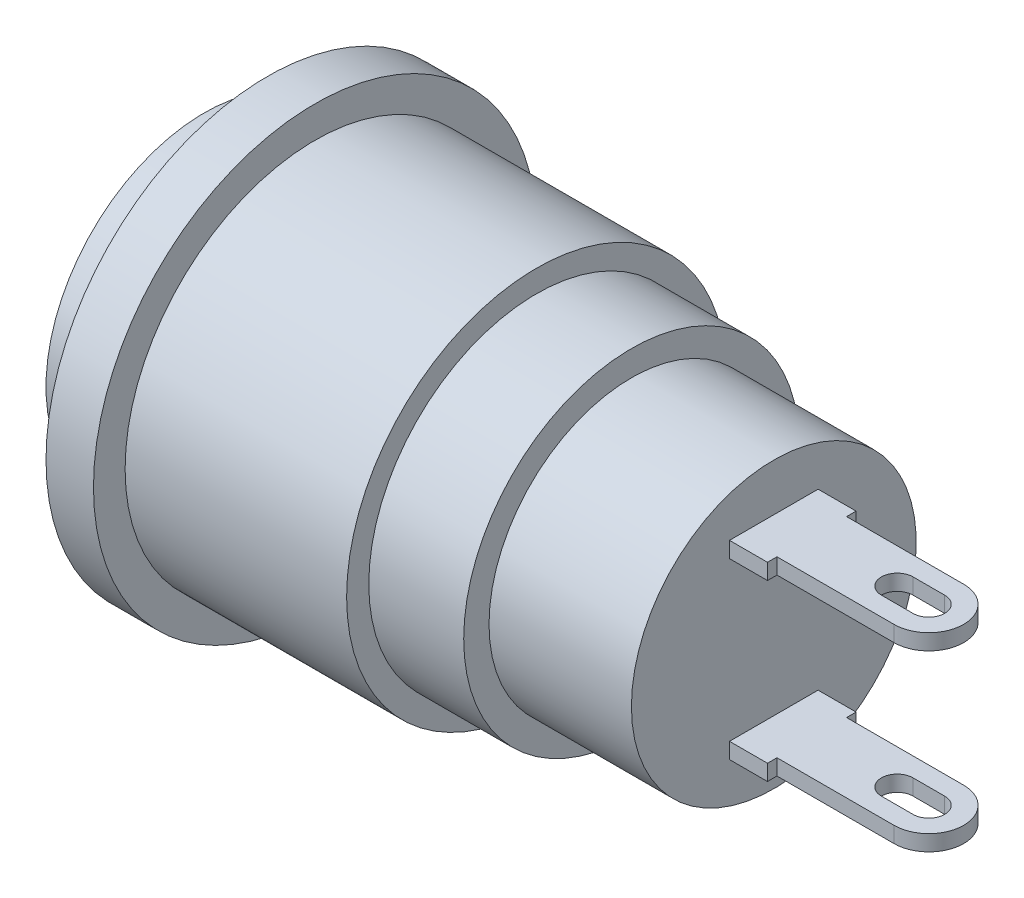
ISO-10303-21;
HEADER;
FILE_DESCRIPTION(('STEP AP214'),'2;1');
FILE_NAME('part.step','',(''),(''),'','','');
FILE_SCHEMA(('AUTOMOTIVE_DESIGN { 1 0 10303 214 1 1 1 1 }'));
ENDSEC;
DATA;
#1=APPLICATION_CONTEXT('core data for automotive mechanical design processes');
#2=APPLICATION_PROTOCOL_DEFINITION('international standard','automotive_design',2000,#1);
#3=PRODUCT_CONTEXT('',#1,'mechanical');
#4=PRODUCT('Part','Part','',(#3));
#5=PRODUCT_RELATED_PRODUCT_CATEGORY('part','',(#4));
#6=PRODUCT_DEFINITION_FORMATION('','',#4);
#7=PRODUCT_DEFINITION_CONTEXT('part definition',#1,'design');
#8=PRODUCT_DEFINITION('design','',#6,#7);
#9=PRODUCT_DEFINITION_SHAPE('','',#8);
#10=(LENGTH_UNIT() NAMED_UNIT(*) SI_UNIT(.MILLI.,.METRE.));
#11=(NAMED_UNIT(*) PLANE_ANGLE_UNIT() SI_UNIT($,.RADIAN.));
#12=(NAMED_UNIT(*) SI_UNIT($,.STERADIAN.) SOLID_ANGLE_UNIT());
#13=UNCERTAINTY_MEASURE_WITH_UNIT(LENGTH_MEASURE(1.E-05),#10,'distance_accuracy_value','');
#14=(GEOMETRIC_REPRESENTATION_CONTEXT(3) GLOBAL_UNCERTAINTY_ASSIGNED_CONTEXT((#13)) GLOBAL_UNIT_ASSIGNED_CONTEXT((#10,
#11,#12)) REPRESENTATION_CONTEXT('',''));
#15=CARTESIAN_POINT('',(0.,0.,0.));
#16=DIRECTION('',(0.,0.,1.));
#17=DIRECTION('',(1.,0.,0.));
#18=AXIS2_PLACEMENT_3D('',#15,#16,#17);
#19=CARTESIAN_POINT('',(8.,0.,-4.5));
#20=DIRECTION('',(-1.,0.,0.));
#21=DIRECTION('',(0.,0.,1.));
#22=AXIS2_PLACEMENT_3D('',#19,#20,#21);
#23=PLANE('',#22);
#24=CARTESIAN_POINT('',(8.,0.,0.));
#25=DIRECTION('',(-1.,0.,0.));
#26=DIRECTION('',(0.,0.,1.));
#27=AXIS2_PLACEMENT_3D('',#24,#25,#26);
#28=CIRCLE('',#27,4.5);
#29=CARTESIAN_POINT('',(8.,0.,4.5));
#30=VERTEX_POINT('',#29);
#31=EDGE_CURVE('E465',#30,#30,#28,.T.);
#32=ORIENTED_EDGE('',*,*,#31,.F.);
#33=EDGE_LOOP('',(#32));
#34=FACE_BOUND('',#33,.T.);
#35=DIRECTION('',(0.,1.,0.));
#36=VECTOR('',#35,1.);
#37=CARTESIAN_POINT('',(8.,2.5,-1.4));
#38=LINE('',#37,#36);
#39=CARTESIAN_POINT('',(8.,2.5,-1.4));
#40=VERTEX_POINT('',#39);
#41=CARTESIAN_POINT('',(8.,3.,-1.4));
#42=VERTEX_POINT('',#41);
#43=EDGE_CURVE('E348',#40,#42,#38,.T.);
#44=ORIENTED_EDGE('',*,*,#43,.F.);
#45=DIRECTION('',(0.,0.,1.));
#46=VECTOR('',#45,1.);
#47=CARTESIAN_POINT('',(8.,2.5,1.4));
#48=LINE('',#47,#46);
#49=CARTESIAN_POINT('',(8.,2.5,1.4));
#50=VERTEX_POINT('',#49);
#51=EDGE_CURVE('E327',#40,#50,#48,.T.);
#52=ORIENTED_EDGE('',*,*,#51,.T.);
#53=DIRECTION('',(0.,1.,0.));
#54=VECTOR('',#53,1.);
#55=CARTESIAN_POINT('',(8.,2.5,1.4));
#56=LINE('',#55,#54);
#57=CARTESIAN_POINT('',(8.,3.,1.4));
#58=VERTEX_POINT('',#57);
#59=EDGE_CURVE('E384',#50,#58,#56,.T.);
#60=ORIENTED_EDGE('',*,*,#59,.T.);
#61=DIRECTION('',(0.,0.,1.));
#62=VECTOR('',#61,1.);
#63=CARTESIAN_POINT('',(8.,3.,1.4));
#64=LINE('',#63,#62);
#65=EDGE_CURVE('E351',#42,#58,#64,.T.);
#66=ORIENTED_EDGE('',*,*,#65,.F.);
#67=EDGE_LOOP('',(#44,#52,#60,#66));
#68=FACE_BOUND('',#67,.T.);
#69=DIRECTION('',(0.,-1.,0.));
#70=VECTOR('',#69,1.);
#71=CARTESIAN_POINT('',(8.,-2.5,-1.4));
#72=LINE('',#71,#70);
#73=CARTESIAN_POINT('',(8.,-2.5,-1.4));
#74=VERTEX_POINT('',#73);
#75=CARTESIAN_POINT('',(8.,-3.,-1.4));
#76=VERTEX_POINT('',#75);
#77=EDGE_CURVE('E52',#74,#76,#72,.T.);
#78=ORIENTED_EDGE('',*,*,#77,.T.);
#79=DIRECTION('',(0.,0.,1.));
#80=VECTOR('',#79,1.);
#81=CARTESIAN_POINT('',(8.,-3.,1.4));
#82=LINE('',#81,#80);
#83=CARTESIAN_POINT('',(8.,-3.,1.4));
#84=VERTEX_POINT('',#83);
#85=EDGE_CURVE('E241',#76,#84,#82,.T.);
#86=ORIENTED_EDGE('',*,*,#85,.T.);
#87=DIRECTION('',(0.,-1.,0.));
#88=VECTOR('',#87,1.);
#89=CARTESIAN_POINT('',(8.,-2.5,1.4));
#90=LINE('',#89,#88);
#91=CARTESIAN_POINT('',(8.,-2.5,1.4));
#92=VERTEX_POINT('',#91);
#93=EDGE_CURVE('E272',#92,#84,#90,.T.);
#94=ORIENTED_EDGE('',*,*,#93,.F.);
#95=DIRECTION('',(0.,0.,1.));
#96=VECTOR('',#95,1.);
#97=CARTESIAN_POINT('',(8.,-2.5,1.4));
#98=LINE('',#97,#96);
#99=EDGE_CURVE('E47',#74,#92,#98,.T.);
#100=ORIENTED_EDGE('',*,*,#99,.F.);
#101=EDGE_LOOP('',(#78,#86,#94,#100));
#102=FACE_BOUND('',#101,.T.);
#103=ADVANCED_FACE('F32',(#34,#68,#102),#23,.F.);
#104=CARTESIAN_POINT('',(-6.5,0.,-6.));
#105=DIRECTION('',(-1.,0.,0.));
#106=DIRECTION('',(0.,0.,1.));
#107=AXIS2_PLACEMENT_3D('',#104,#105,#106);
#108=PLANE('',#107);
#109=CARTESIAN_POINT('',(-6.5,0.,0.));
#110=DIRECTION('',(-1.,0.,0.));
#111=DIRECTION('',(0.,0.,1.));
#112=AXIS2_PLACEMENT_3D('',#109,#110,#111);
#113=CIRCLE('',#112,7.);
#114=CARTESIAN_POINT('',(-6.5,0.,7.));
#115=VERTEX_POINT('',#114);
#116=EDGE_CURVE('E11',#115,#115,#113,.T.);
#117=ORIENTED_EDGE('',*,*,#116,.F.);
#118=EDGE_LOOP('',(#117));
#119=FACE_BOUND('',#118,.T.);
#120=CARTESIAN_POINT('',(-6.5,0.,0.));
#121=DIRECTION('',(-1.,0.,0.));
#122=DIRECTION('',(0.,0.,1.));
#123=AXIS2_PLACEMENT_3D('',#120,#121,#122);
#124=CIRCLE('',#123,6.);
#125=CARTESIAN_POINT('',(-6.5,0.,6.));
#126=VERTEX_POINT('',#125);
#127=EDGE_CURVE('E448',#126,#126,#124,.T.);
#128=ORIENTED_EDGE('',*,*,#127,.T.);
#129=EDGE_LOOP('',(#128));
#130=FACE_BOUND('',#129,.T.);
#131=ADVANCED_FACE('F34',(#119,#130),#108,.F.);
#132=CARTESIAN_POINT('',(-8.,0.,0.));
#133=DIRECTION('',(-1.,0.,0.));
#134=DIRECTION('',(0.,0.,1.));
#135=AXIS2_PLACEMENT_3D('',#132,#133,#134);
#136=CYLINDRICAL_SURFACE('',#135,7.);
#137=CARTESIAN_POINT('',(-8.,0.,0.));
#138=DIRECTION('',(-1.,0.,0.));
#139=DIRECTION('',(0.,0.,1.));
#140=AXIS2_PLACEMENT_3D('',#137,#138,#139);
#141=CIRCLE('',#140,7.);
#142=CARTESIAN_POINT('',(-8.,0.,7.));
#143=VERTEX_POINT('',#142);
#144=EDGE_CURVE('E40',#143,#143,#141,.T.);
#145=ORIENTED_EDGE('',*,*,#144,.F.);
#146=EDGE_LOOP('',(#145));
#147=FACE_BOUND('',#146,.T.);
#148=ORIENTED_EDGE('',*,*,#116,.T.);
#149=EDGE_LOOP('',(#148));
#150=FACE_BOUND('',#149,.T.);
#151=ADVANCED_FACE('F433',(#147,#150),#136,.T.);
#152=CARTESIAN_POINT('',(-8.,0.,-7.));
#153=DIRECTION('',(1.,0.,0.));
#154=DIRECTION('',(0.,0.,-1.));
#155=AXIS2_PLACEMENT_3D('',#152,#153,#154);
#156=PLANE('',#155);
#157=CARTESIAN_POINT('',(-8.,0.,0.));
#158=DIRECTION('',(1.,0.,0.));
#159=DIRECTION('',(0.,0.,-1.));
#160=AXIS2_PLACEMENT_3D('',#157,#158,#159);
#161=CIRCLE('',#160,5.);
#162=CARTESIAN_POINT('',(-8.,0.,-5.));
#163=VERTEX_POINT('',#162);
#164=EDGE_CURVE('E450',#163,#163,#161,.T.);
#165=ORIENTED_EDGE('',*,*,#164,.T.);
#166=EDGE_LOOP('',(#165));
#167=FACE_BOUND('',#166,.T.);
#168=ORIENTED_EDGE('',*,*,#144,.T.);
#169=EDGE_LOOP('',(#168));
#170=FACE_BOUND('',#169,.T.);
#171=ADVANCED_FACE('F427',(#167,#170),#156,.F.);
#172=CARTESIAN_POINT('',(-8.,0.,0.));
#173=DIRECTION('',(-1.,0.,0.));
#174=DIRECTION('',(0.,0.,1.));
#175=AXIS2_PLACEMENT_3D('',#172,#173,#174);
#176=CYLINDRICAL_SURFACE('',#175,4.5);
#177=CARTESIAN_POINT('',(3.5,0.,0.));
#178=DIRECTION('',(-1.,0.,0.));
#179=DIRECTION('',(0.,0.,1.));
#180=AXIS2_PLACEMENT_3D('',#177,#178,#179);
#181=CIRCLE('',#180,4.5);
#182=CARTESIAN_POINT('',(3.5,0.,4.5));
#183=VERTEX_POINT('',#182);
#184=EDGE_CURVE('E462',#183,#183,#181,.T.);
#185=ORIENTED_EDGE('',*,*,#184,.F.);
#186=EDGE_LOOP('',(#185));
#187=FACE_BOUND('',#186,.T.);
#188=ORIENTED_EDGE('',*,*,#31,.T.);
#189=EDGE_LOOP('',(#188));
#190=FACE_BOUND('',#189,.T.);
#191=ADVANCED_FACE('F423',(#187,#190),#176,.T.);
#192=CARTESIAN_POINT('',(3.5,0.,-5.3));
#193=DIRECTION('',(-1.,0.,0.));
#194=DIRECTION('',(0.,0.,1.));
#195=AXIS2_PLACEMENT_3D('',#192,#193,#194);
#196=PLANE('',#195);
#197=CARTESIAN_POINT('',(3.5,0.,0.));
#198=DIRECTION('',(-1.,0.,0.));
#199=DIRECTION('',(0.,0.,1.));
#200=AXIS2_PLACEMENT_3D('',#197,#198,#199);
#201=CIRCLE('',#200,5.3);
#202=CARTESIAN_POINT('',(3.5,0.,5.3));
#203=VERTEX_POINT('',#202);
#204=EDGE_CURVE('E459',#203,#203,#201,.T.);
#205=ORIENTED_EDGE('',*,*,#204,.F.);
#206=EDGE_LOOP('',(#205));
#207=FACE_BOUND('',#206,.T.);
#208=ORIENTED_EDGE('',*,*,#184,.T.);
#209=EDGE_LOOP('',(#208));
#210=FACE_BOUND('',#209,.T.);
#211=ADVANCED_FACE('F419',(#207,#210),#196,.F.);
#212=CARTESIAN_POINT('',(-8.,0.,0.));
#213=DIRECTION('',(-1.,0.,0.));
#214=DIRECTION('',(0.,0.,1.));
#215=AXIS2_PLACEMENT_3D('',#212,#213,#214);
#216=CYLINDRICAL_SURFACE('',#215,5.3);
#217=CARTESIAN_POINT('',(0.5,0.,0.));
#218=DIRECTION('',(-1.,0.,0.));
#219=DIRECTION('',(0.,0.,1.));
#220=AXIS2_PLACEMENT_3D('',#217,#218,#219);
#221=CIRCLE('',#220,5.3);
#222=CARTESIAN_POINT('',(0.5,0.,5.3));
#223=VERTEX_POINT('',#222);
#224=EDGE_CURVE('E453',#223,#223,#221,.T.);
#225=ORIENTED_EDGE('',*,*,#224,.F.);
#226=EDGE_LOOP('',(#225));
#227=FACE_BOUND('',#226,.T.);
#228=ORIENTED_EDGE('',*,*,#204,.T.);
#229=EDGE_LOOP('',(#228));
#230=FACE_BOUND('',#229,.T.);
#231=ADVANCED_FACE('F415',(#227,#230),#216,.T.);
#232=CARTESIAN_POINT('',(0.5,0.,-6.));
#233=DIRECTION('',(-1.,0.,0.));
#234=DIRECTION('',(0.,0.,1.));
#235=AXIS2_PLACEMENT_3D('',#232,#233,#234);
#236=PLANE('',#235);
#237=CARTESIAN_POINT('',(0.5,0.,0.));
#238=DIRECTION('',(-1.,0.,0.));
#239=DIRECTION('',(0.,0.,1.));
#240=AXIS2_PLACEMENT_3D('',#237,#238,#239);
#241=CIRCLE('',#240,6.);
#242=CARTESIAN_POINT('',(0.5,0.,6.));
#243=VERTEX_POINT('',#242);
#244=EDGE_CURVE('E449',#243,#243,#241,.T.);
#245=ORIENTED_EDGE('',*,*,#244,.F.);
#246=EDGE_LOOP('',(#245));
#247=FACE_BOUND('',#246,.T.);
#248=ORIENTED_EDGE('',*,*,#224,.T.);
#249=EDGE_LOOP('',(#248));
#250=FACE_BOUND('',#249,.T.);
#251=ADVANCED_FACE('F411',(#247,#250),#236,.F.);
#252=CARTESIAN_POINT('',(-8.,0.,0.));
#253=DIRECTION('',(-1.,0.,0.));
#254=DIRECTION('',(0.,0.,1.));
#255=AXIS2_PLACEMENT_3D('',#252,#253,#254);
#256=CYLINDRICAL_SURFACE('',#255,6.);
#257=ORIENTED_EDGE('',*,*,#127,.F.);
#258=EDGE_LOOP('',(#257));
#259=FACE_BOUND('',#258,.T.);
#260=ORIENTED_EDGE('',*,*,#244,.T.);
#261=EDGE_LOOP('',(#260));
#262=FACE_BOUND('',#261,.T.);
#263=ADVANCED_FACE('F407',(#259,#262),#256,.T.);
#264=CARTESIAN_POINT('',(-8.,0.,0.));
#265=DIRECTION('',(1.,0.,0.));
#266=DIRECTION('',(0.,0.,-1.));
#267=AXIS2_PLACEMENT_3D('',#264,#265,#266);
#268=CYLINDRICAL_SURFACE('',#267,5.);
#269=CARTESIAN_POINT('',(-10.,0.,0.));
#270=DIRECTION('',(1.,0.,0.));
#271=DIRECTION('',(0.,0.,-1.));
#272=AXIS2_PLACEMENT_3D('',#269,#270,#271);
#273=CIRCLE('',#272,5.);
#274=CARTESIAN_POINT('',(-10.,0.,-5.));
#275=VERTEX_POINT('',#274);
#276=EDGE_CURVE('E373',#275,#275,#273,.T.);
#277=ORIENTED_EDGE('',*,*,#276,.T.);
#278=EDGE_LOOP('',(#277));
#279=FACE_BOUND('',#278,.T.);
#280=ORIENTED_EDGE('',*,*,#164,.F.);
#281=EDGE_LOOP('',(#280));
#282=FACE_BOUND('',#281,.T.);
#283=ADVANCED_FACE('F402',(#279,#282),#268,.T.);
#284=CARTESIAN_POINT('',(-10.,0.,-5.));
#285=CARTESIAN_POINT('',(-11.,0.,-2.65148742139601));
#286=CARTESIAN_POINT('',(-11.,0.,0.));
#287=B_SPLINE_CURVE_WITH_KNOTS('',2,(#284,#285,#286),.UNSPECIFIED.,.F.,.F.,(3,3),(0.,1.),.UNSPECIFIED.);
#288=CARTESIAN_POINT('',(-8.,0.,0.));
#289=DIRECTION('',(1.,0.,0.));
#290=AXIS1_PLACEMENT('',#288,#289);
#291=SURFACE_OF_REVOLUTION('',#287,#290);
#292=CARTESIAN_POINT('',(-11.,0.,0.));
#293=VERTEX_POINT('',#292);
#294=VERTEX_LOOP('',#293);
#295=FACE_BOUND('',#294,.T.);
#296=ORIENTED_EDGE('',*,*,#276,.F.);
#297=EDGE_LOOP('',(#296));
#298=FACE_BOUND('',#297,.T.);
#299=ADVANCED_FACE('F397',(#295,#298),#291,.F.);
#300=CARTESIAN_POINT('',(8.,2.5,-1.4));
#301=DIRECTION('',(0.,0.,-1.));
#302=DIRECTION('',(-1.,0.,0.));
#303=AXIS2_PLACEMENT_3D('',#300,#301,#302);
#304=PLANE('',#303);
#305=DIRECTION('',(-1.,0.,0.));
#306=VECTOR('',#305,1.);
#307=CARTESIAN_POINT('',(8.,3.,-1.4));
#308=LINE('',#307,#306);
#309=CARTESIAN_POINT('',(9.2,3.,-1.4));
#310=VERTEX_POINT('',#309);
#311=EDGE_CURVE('E317',#310,#42,#308,.T.);
#312=ORIENTED_EDGE('',*,*,#311,.F.);
#313=DIRECTION('',(0.,1.,0.));
#314=VECTOR('',#313,1.);
#315=CARTESIAN_POINT('',(9.2,2.5,-1.4));
#316=LINE('',#315,#314);
#317=CARTESIAN_POINT('',(9.2,2.5,-1.4));
#318=VERTEX_POINT('',#317);
#319=EDGE_CURVE('E371',#318,#310,#316,.T.);
#320=ORIENTED_EDGE('',*,*,#319,.F.);
#321=DIRECTION('',(-1.,0.,0.));
#322=VECTOR('',#321,1.);
#323=CARTESIAN_POINT('',(8.,2.5,-1.4));
#324=LINE('',#323,#322);
#325=EDGE_CURVE('E324',#318,#40,#324,.T.);
#326=ORIENTED_EDGE('',*,*,#325,.T.);
#327=ORIENTED_EDGE('',*,*,#43,.T.);
#328=EDGE_LOOP('',(#312,#320,#326,#327));
#329=FACE_BOUND('',#328,.T.);
#330=ADVANCED_FACE('F401',(#329),#304,.T.);
#331=CARTESIAN_POINT('',(9.2,2.5,-1.4));
#332=DIRECTION('',(1.,0.,0.));
#333=DIRECTION('',(0.,0.,-1.));
#334=AXIS2_PLACEMENT_3D('',#331,#332,#333);
#335=PLANE('',#334);
#336=DIRECTION('',(0.,0.,-1.));
#337=VECTOR('',#336,1.);
#338=CARTESIAN_POINT('',(9.2,3.,-1.4));
#339=LINE('',#338,#337);
#340=CARTESIAN_POINT('',(9.2,3.,-1.1));
#341=VERTEX_POINT('',#340);
#342=EDGE_CURVE('E328',#341,#310,#339,.T.);
#343=ORIENTED_EDGE('',*,*,#342,.F.);
#344=DIRECTION('',(0.,1.,0.));
#345=VECTOR('',#344,1.);
#346=CARTESIAN_POINT('',(9.2,2.5,-1.1));
#347=LINE('',#346,#345);
#348=CARTESIAN_POINT('',(9.2,2.5,-1.1));
#349=VERTEX_POINT('',#348);
#350=EDGE_CURVE('E374',#349,#341,#347,.T.);
#351=ORIENTED_EDGE('',*,*,#350,.F.);
#352=DIRECTION('',(0.,0.,-1.));
#353=VECTOR('',#352,1.);
#354=CARTESIAN_POINT('',(9.2,2.5,-1.4));
#355=LINE('',#354,#353);
#356=EDGE_CURVE('E345',#349,#318,#355,.T.);
#357=ORIENTED_EDGE('',*,*,#356,.T.);
#358=ORIENTED_EDGE('',*,*,#319,.T.);
#359=EDGE_LOOP('',(#343,#351,#357,#358));
#360=FACE_BOUND('',#359,.T.);
#361=ADVANCED_FACE('F483',(#360),#335,.T.);
#362=CARTESIAN_POINT('',(9.2,2.5,-1.1));
#363=DIRECTION('',(0.,0.,-1.));
#364=DIRECTION('',(-1.,0.,0.));
#365=AXIS2_PLACEMENT_3D('',#362,#363,#364);
#366=PLANE('',#365);
#367=DIRECTION('',(-1.,0.,0.));
#368=VECTOR('',#367,1.);
#369=CARTESIAN_POINT('',(9.2,3.,-1.1));
#370=LINE('',#369,#368);
#371=CARTESIAN_POINT('',(12.9,3.,-1.1));
#372=VERTEX_POINT('',#371);
#373=EDGE_CURVE('E366',#372,#341,#370,.T.);
#374=ORIENTED_EDGE('',*,*,#373,.F.);
#375=DIRECTION('',(0.,1.,0.));
#376=VECTOR('',#375,1.);
#377=CARTESIAN_POINT('',(12.9,2.5,-1.1));
#378=LINE('',#377,#376);
#379=CARTESIAN_POINT('',(12.9,2.5,-1.1));
#380=VERTEX_POINT('',#379);
#381=EDGE_CURVE('E376',#380,#372,#378,.T.);
#382=ORIENTED_EDGE('',*,*,#381,.F.);
#383=DIRECTION('',(-1.,0.,0.));
#384=VECTOR('',#383,1.);
#385=CARTESIAN_POINT('',(9.2,2.5,-1.1));
#386=LINE('',#385,#384);
#387=EDGE_CURVE('E342',#380,#349,#386,.T.);
#388=ORIENTED_EDGE('',*,*,#387,.T.);
#389=ORIENTED_EDGE('',*,*,#350,.T.);
#390=EDGE_LOOP('',(#374,#382,#388,#389));
#391=FACE_BOUND('',#390,.T.);
#392=ADVANCED_FACE('F503',(#391),#366,.T.);
#393=CARTESIAN_POINT('',(12.9,2.5,0.));
#394=DIRECTION('',(0.,1.,0.));
#395=DIRECTION('',(0.,0.,1.));
#396=AXIS2_PLACEMENT_3D('',#393,#394,#395);
#397=CYLINDRICAL_SURFACE('',#396,1.1);
#398=CARTESIAN_POINT('',(12.9,3.,0.));
#399=DIRECTION('',(0.,1.,0.));
#400=DIRECTION('',(0.,0.,-1.));
#401=AXIS2_PLACEMENT_3D('',#398,#399,#400);
#402=CIRCLE('',#401,1.1);
#403=CARTESIAN_POINT('',(12.9,3.,1.1));
#404=VERTEX_POINT('',#403);
#405=EDGE_CURVE('E363',#404,#372,#402,.T.);
#406=ORIENTED_EDGE('',*,*,#405,.F.);
#407=DIRECTION('',(0.,1.,0.));
#408=VECTOR('',#407,1.);
#409=CARTESIAN_POINT('',(12.9,2.5,1.1));
#410=LINE('',#409,#408);
#411=CARTESIAN_POINT('',(12.9,2.5,1.1));
#412=VERTEX_POINT('',#411);
#413=EDGE_CURVE('E378',#412,#404,#410,.T.);
#414=ORIENTED_EDGE('',*,*,#413,.F.);
#415=CARTESIAN_POINT('',(12.9,2.5,0.));
#416=DIRECTION('',(0.,1.,0.));
#417=DIRECTION('',(0.,0.,-1.));
#418=AXIS2_PLACEMENT_3D('',#415,#416,#417);
#419=CIRCLE('',#418,1.1);
#420=EDGE_CURVE('E339',#412,#380,#419,.T.);
#421=ORIENTED_EDGE('',*,*,#420,.T.);
#422=ORIENTED_EDGE('',*,*,#381,.T.);
#423=EDGE_LOOP('',(#406,#414,#421,#422));
#424=FACE_BOUND('',#423,.T.);
#425=ADVANCED_FACE('F490',(#424),#397,.T.);
#426=CARTESIAN_POINT('',(9.2,2.5,1.1));
#427=DIRECTION('',(0.,0.,1.));
#428=DIRECTION('',(1.,0.,0.));
#429=AXIS2_PLACEMENT_3D('',#426,#427,#428);
#430=PLANE('',#429);
#431=DIRECTION('',(1.,0.,0.));
#432=VECTOR('',#431,1.);
#433=CARTESIAN_POINT('',(9.2,3.,1.1));
#434=LINE('',#433,#432);
#435=CARTESIAN_POINT('',(9.2,3.,1.1));
#436=VERTEX_POINT('',#435);
#437=EDGE_CURVE('E360',#436,#404,#434,.T.);
#438=ORIENTED_EDGE('',*,*,#437,.F.);
#439=DIRECTION('',(0.,1.,0.));
#440=VECTOR('',#439,1.);
#441=CARTESIAN_POINT('',(9.2,2.5,1.1));
#442=LINE('',#441,#440);
#443=CARTESIAN_POINT('',(9.2,2.5,1.1));
#444=VERTEX_POINT('',#443);
#445=EDGE_CURVE('E380',#444,#436,#442,.T.);
#446=ORIENTED_EDGE('',*,*,#445,.F.);
#447=DIRECTION('',(1.,0.,0.));
#448=VECTOR('',#447,1.);
#449=CARTESIAN_POINT('',(9.2,2.5,1.1));
#450=LINE('',#449,#448);
#451=EDGE_CURVE('E336',#444,#412,#450,.T.);
#452=ORIENTED_EDGE('',*,*,#451,.T.);
#453=ORIENTED_EDGE('',*,*,#413,.T.);
#454=EDGE_LOOP('',(#438,#446,#452,#453));
#455=FACE_BOUND('',#454,.T.);
#456=ADVANCED_FACE('F494',(#455),#430,.T.);
#457=CARTESIAN_POINT('',(9.2,2.5,1.4));
#458=DIRECTION('',(1.,0.,0.));
#459=DIRECTION('',(0.,0.,-1.));
#460=AXIS2_PLACEMENT_3D('',#457,#458,#459);
#461=PLANE('',#460);
#462=DIRECTION('',(0.,0.,-1.));
#463=VECTOR('',#462,1.);
#464=CARTESIAN_POINT('',(9.2,3.,1.4));
#465=LINE('',#464,#463);
#466=CARTESIAN_POINT('',(9.2,3.,1.4));
#467=VERTEX_POINT('',#466);
#468=EDGE_CURVE('E357',#467,#436,#465,.T.);
#469=ORIENTED_EDGE('',*,*,#468,.F.);
#470=DIRECTION('',(0.,1.,0.));
#471=VECTOR('',#470,1.);
#472=CARTESIAN_POINT('',(9.2,2.5,1.4));
#473=LINE('',#472,#471);
#474=CARTESIAN_POINT('',(9.2,2.5,1.4));
#475=VERTEX_POINT('',#474);
#476=EDGE_CURVE('E382',#475,#467,#473,.T.);
#477=ORIENTED_EDGE('',*,*,#476,.F.);
#478=DIRECTION('',(0.,0.,-1.));
#479=VECTOR('',#478,1.);
#480=CARTESIAN_POINT('',(9.2,2.5,1.4));
#481=LINE('',#480,#479);
#482=EDGE_CURVE('E333',#475,#444,#481,.T.);
#483=ORIENTED_EDGE('',*,*,#482,.T.);
#484=ORIENTED_EDGE('',*,*,#445,.T.);
#485=EDGE_LOOP('',(#469,#477,#483,#484));
#486=FACE_BOUND('',#485,.T.);
#487=ADVANCED_FACE('F497',(#486),#461,.T.);
#488=CARTESIAN_POINT('',(8.,2.5,1.4));
#489=DIRECTION('',(0.,0.,1.));
#490=DIRECTION('',(1.,0.,0.));
#491=AXIS2_PLACEMENT_3D('',#488,#489,#490);
#492=PLANE('',#491);
#493=DIRECTION('',(1.,0.,0.));
#494=VECTOR('',#493,1.);
#495=CARTESIAN_POINT('',(8.,3.,1.4));
#496=LINE('',#495,#494);
#497=EDGE_CURVE('E354',#58,#467,#496,.T.);
#498=ORIENTED_EDGE('',*,*,#497,.F.);
#499=ORIENTED_EDGE('',*,*,#59,.F.);
#500=DIRECTION('',(1.,0.,0.));
#501=VECTOR('',#500,1.);
#502=CARTESIAN_POINT('',(8.,2.5,1.4));
#503=LINE('',#502,#501);
#504=EDGE_CURVE('E330',#50,#475,#503,.T.);
#505=ORIENTED_EDGE('',*,*,#504,.T.);
#506=ORIENTED_EDGE('',*,*,#476,.T.);
#507=EDGE_LOOP('',(#498,#499,#505,#506));
#508=FACE_BOUND('',#507,.T.);
#509=ADVANCED_FACE('F500',(#508),#492,.T.);
#510=CARTESIAN_POINT('',(12.9,2.5,0.));
#511=DIRECTION('',(0.,-1.,0.));
#512=DIRECTION('',(0.,0.,-1.));
#513=AXIS2_PLACEMENT_3D('',#510,#511,#512);
#514=PLANE('',#513);
#515=CARTESIAN_POINT('',(11.9,2.5,0.));
#516=DIRECTION('',(0.,1.,0.));
#517=DIRECTION('',(0.,0.,1.));
#518=AXIS2_PLACEMENT_3D('',#515,#516,#517);
#519=CIRCLE('',#518,0.5);
#520=CARTESIAN_POINT('',(11.9,2.5,-0.5));
#521=VERTEX_POINT('',#520);
#522=CARTESIAN_POINT('',(11.9,2.5,0.5));
#523=VERTEX_POINT('',#522);
#524=EDGE_CURVE('E292',#521,#523,#519,.T.);
#525=ORIENTED_EDGE('',*,*,#524,.T.);
#526=DIRECTION('',(1.,0.,0.));
#527=VECTOR('',#526,1.);
#528=CARTESIAN_POINT('',(11.9,2.5,0.5));
#529=LINE('',#528,#527);
#530=CARTESIAN_POINT('',(12.9,2.5,0.5));
#531=VERTEX_POINT('',#530);
#532=EDGE_CURVE('E295',#523,#531,#529,.T.);
#533=ORIENTED_EDGE('',*,*,#532,.T.);
#534=CARTESIAN_POINT('',(12.9,2.5,0.));
#535=DIRECTION('',(0.,1.,0.));
#536=DIRECTION('',(0.,0.,1.));
#537=AXIS2_PLACEMENT_3D('',#534,#535,#536);
#538=CIRCLE('',#537,0.5);
#539=CARTESIAN_POINT('',(12.9,2.5,-0.5));
#540=VERTEX_POINT('',#539);
#541=EDGE_CURVE('E299',#531,#540,#538,.T.);
#542=ORIENTED_EDGE('',*,*,#541,.T.);
#543=DIRECTION('',(-1.,0.,0.));
#544=VECTOR('',#543,1.);
#545=CARTESIAN_POINT('',(11.9,2.5,-0.5));
#546=LINE('',#545,#544);
#547=EDGE_CURVE('E302',#540,#521,#546,.T.);
#548=ORIENTED_EDGE('',*,*,#547,.T.);
#549=EDGE_LOOP('',(#525,#533,#542,#548));
#550=FACE_BOUND('',#549,.T.);
#551=ORIENTED_EDGE('',*,*,#325,.F.);
#552=ORIENTED_EDGE('',*,*,#356,.F.);
#553=ORIENTED_EDGE('',*,*,#387,.F.);
#554=ORIENTED_EDGE('',*,*,#420,.F.);
#555=ORIENTED_EDGE('',*,*,#451,.F.);
#556=ORIENTED_EDGE('',*,*,#482,.F.);
#557=ORIENTED_EDGE('',*,*,#504,.F.);
#558=ORIENTED_EDGE('',*,*,#51,.F.);
#559=EDGE_LOOP('',(#551,#552,#553,#554,#555,#556,#557,#558));
#560=FACE_BOUND('',#559,.T.);
#561=ADVANCED_FACE('F478',(#550,#560),#514,.T.);
#562=CARTESIAN_POINT('',(12.9,3.,0.));
#563=DIRECTION('',(0.,-1.,0.));
#564=DIRECTION('',(0.,0.,-1.));
#565=AXIS2_PLACEMENT_3D('',#562,#563,#564);
#566=PLANE('',#565);
#567=DIRECTION('',(1.,0.,0.));
#568=VECTOR('',#567,1.);
#569=CARTESIAN_POINT('',(11.9,3.,0.5));
#570=LINE('',#569,#568);
#571=CARTESIAN_POINT('',(11.9,3.,0.5));
#572=VERTEX_POINT('',#571);
#573=CARTESIAN_POINT('',(12.9,3.,0.5));
#574=VERTEX_POINT('',#573);
#575=EDGE_CURVE('E307',#572,#574,#570,.T.);
#576=ORIENTED_EDGE('',*,*,#575,.F.);
#577=CARTESIAN_POINT('',(11.9,3.,0.));
#578=DIRECTION('',(0.,1.,0.));
#579=DIRECTION('',(0.,0.,1.));
#580=AXIS2_PLACEMENT_3D('',#577,#578,#579);
#581=CIRCLE('',#580,0.5);
#582=CARTESIAN_POINT('',(11.9,3.,-0.5));
#583=VERTEX_POINT('',#582);
#584=EDGE_CURVE('E271',#583,#572,#581,.T.);
#585=ORIENTED_EDGE('',*,*,#584,.F.);
#586=DIRECTION('',(-1.,0.,0.));
#587=VECTOR('',#586,1.);
#588=CARTESIAN_POINT('',(11.9,3.,-0.5));
#589=LINE('',#588,#587);
#590=CARTESIAN_POINT('',(12.9,3.,-0.5));
#591=VERTEX_POINT('',#590);
#592=EDGE_CURVE('E296',#591,#583,#589,.T.);
#593=ORIENTED_EDGE('',*,*,#592,.F.);
#594=CARTESIAN_POINT('',(12.9,3.,0.));
#595=DIRECTION('',(0.,1.,0.));
#596=DIRECTION('',(0.,0.,1.));
#597=AXIS2_PLACEMENT_3D('',#594,#595,#596);
#598=CIRCLE('',#597,0.5);
#599=EDGE_CURVE('E310',#574,#591,#598,.T.);
#600=ORIENTED_EDGE('',*,*,#599,.F.);
#601=EDGE_LOOP('',(#576,#585,#593,#600));
#602=FACE_BOUND('',#601,.T.);
#603=ORIENTED_EDGE('',*,*,#311,.T.);
#604=ORIENTED_EDGE('',*,*,#65,.T.);
#605=ORIENTED_EDGE('',*,*,#497,.T.);
#606=ORIENTED_EDGE('',*,*,#468,.T.);
#607=ORIENTED_EDGE('',*,*,#437,.T.);
#608=ORIENTED_EDGE('',*,*,#405,.T.);
#609=ORIENTED_EDGE('',*,*,#373,.T.);
#610=ORIENTED_EDGE('',*,*,#342,.T.);
#611=EDGE_LOOP('',(#603,#604,#605,#606,#607,#608,#609,#610));
#612=FACE_BOUND('',#611,.T.);
#613=ADVANCED_FACE('F502',(#602,#612),#566,.F.);
#614=CARTESIAN_POINT('',(11.9,2.5,0.));
#615=DIRECTION('',(0.,1.,0.));
#616=DIRECTION('',(0.,0.,1.));
#617=AXIS2_PLACEMENT_3D('',#614,#615,#616);
#618=CYLINDRICAL_SURFACE('',#617,0.5);
#619=ORIENTED_EDGE('',*,*,#584,.T.);
#620=DIRECTION('',(0.,1.,0.));
#621=VECTOR('',#620,1.);
#622=CARTESIAN_POINT('',(11.9,2.5,0.5));
#623=LINE('',#622,#621);
#624=EDGE_CURVE('E305',#523,#572,#623,.T.);
#625=ORIENTED_EDGE('',*,*,#624,.F.);
#626=ORIENTED_EDGE('',*,*,#524,.F.);
#627=DIRECTION('',(0.,1.,0.));
#628=VECTOR('',#627,1.);
#629=CARTESIAN_POINT('',(11.9,2.5,-0.5));
#630=LINE('',#629,#628);
#631=EDGE_CURVE('E315',#521,#583,#630,.T.);
#632=ORIENTED_EDGE('',*,*,#631,.T.);
#633=EDGE_LOOP('',(#619,#625,#626,#632));
#634=FACE_BOUND('',#633,.T.);
#635=ADVANCED_FACE('F526',(#634),#618,.F.);
#636=CARTESIAN_POINT('',(11.9,2.5,-0.5));
#637=DIRECTION('',(0.,0.,-1.));
#638=DIRECTION('',(-1.,0.,0.));
#639=AXIS2_PLACEMENT_3D('',#636,#637,#638);
#640=PLANE('',#639);
#641=ORIENTED_EDGE('',*,*,#592,.T.);
#642=ORIENTED_EDGE('',*,*,#631,.F.);
#643=ORIENTED_EDGE('',*,*,#547,.F.);
#644=DIRECTION('',(0.,1.,0.));
#645=VECTOR('',#644,1.);
#646=CARTESIAN_POINT('',(12.9,2.5,-0.5));
#647=LINE('',#646,#645);
#648=EDGE_CURVE('E318',#540,#591,#647,.T.);
#649=ORIENTED_EDGE('',*,*,#648,.T.);
#650=EDGE_LOOP('',(#641,#642,#643,#649));
#651=FACE_BOUND('',#650,.T.);
#652=ADVANCED_FACE('F531',(#651),#640,.F.);
#653=CARTESIAN_POINT('',(12.9,2.5,0.));
#654=DIRECTION('',(0.,1.,0.));
#655=DIRECTION('',(0.,0.,1.));
#656=AXIS2_PLACEMENT_3D('',#653,#654,#655);
#657=CYLINDRICAL_SURFACE('',#656,0.5);
#658=ORIENTED_EDGE('',*,*,#599,.T.);
#659=ORIENTED_EDGE('',*,*,#648,.F.);
#660=ORIENTED_EDGE('',*,*,#541,.F.);
#661=DIRECTION('',(0.,1.,0.));
#662=VECTOR('',#661,1.);
#663=CARTESIAN_POINT('',(12.9,2.5,0.5));
#664=LINE('',#663,#662);
#665=EDGE_CURVE('E320',#531,#574,#664,.T.);
#666=ORIENTED_EDGE('',*,*,#665,.T.);
#667=EDGE_LOOP('',(#658,#659,#660,#666));
#668=FACE_BOUND('',#667,.T.);
#669=ADVANCED_FACE('F536',(#668),#657,.F.);
#670=CARTESIAN_POINT('',(11.9,2.5,0.5));
#671=DIRECTION('',(0.,0.,1.));
#672=DIRECTION('',(1.,0.,0.));
#673=AXIS2_PLACEMENT_3D('',#670,#671,#672);
#674=PLANE('',#673);
#675=ORIENTED_EDGE('',*,*,#575,.T.);
#676=ORIENTED_EDGE('',*,*,#665,.F.);
#677=ORIENTED_EDGE('',*,*,#532,.F.);
#678=ORIENTED_EDGE('',*,*,#624,.T.);
#679=EDGE_LOOP('',(#675,#676,#677,#678));
#680=FACE_BOUND('',#679,.T.);
#681=ADVANCED_FACE('F533',(#680),#674,.F.);
#682=CARTESIAN_POINT('',(12.9,-2.5,0.));
#683=DIRECTION('',(0.,1.,0.));
#684=DIRECTION('',(0.,0.,-1.));
#685=AXIS2_PLACEMENT_3D('',#682,#683,#684);
#686=PLANE('',#685);
#687=DIRECTION('',(-1.,0.,0.));
#688=VECTOR('',#687,1.);
#689=CARTESIAN_POINT('',(8.,-2.5,-1.4));
#690=LINE('',#689,#688);
#691=CARTESIAN_POINT('',(9.2,-2.5,-1.4));
#692=VERTEX_POINT('',#691);
#693=EDGE_CURVE('E238',#692,#74,#690,.T.);
#694=ORIENTED_EDGE('',*,*,#693,.T.);
#695=ORIENTED_EDGE('',*,*,#99,.T.);
#696=DIRECTION('',(1.,0.,0.));
#697=VECTOR('',#696,1.);
#698=CARTESIAN_POINT('',(8.,-2.5,1.4));
#699=LINE('',#698,#697);
#700=CARTESIAN_POINT('',(9.2,-2.5,1.4));
#701=VERTEX_POINT('',#700);
#702=EDGE_CURVE('E251',#92,#701,#699,.T.);
#703=ORIENTED_EDGE('',*,*,#702,.T.);
#704=DIRECTION('',(0.,0.,-1.));
#705=VECTOR('',#704,1.);
#706=CARTESIAN_POINT('',(9.2,-2.5,1.4));
#707=LINE('',#706,#705);
#708=CARTESIAN_POINT('',(9.2,-2.5,1.1));
#709=VERTEX_POINT('',#708);
#710=EDGE_CURVE('E249',#701,#709,#707,.T.);
#711=ORIENTED_EDGE('',*,*,#710,.T.);
#712=DIRECTION('',(1.,0.,0.));
#713=VECTOR('',#712,1.);
#714=CARTESIAN_POINT('',(9.2,-2.5,1.1));
#715=LINE('',#714,#713);
#716=CARTESIAN_POINT('',(12.9,-2.5,1.1));
#717=VERTEX_POINT('',#716);
#718=EDGE_CURVE('E247',#709,#717,#715,.T.);
#719=ORIENTED_EDGE('',*,*,#718,.T.);
#720=CARTESIAN_POINT('',(12.9,-2.5,0.));
#721=DIRECTION('',(0.,1.,0.));
#722=DIRECTION('',(0.,0.,-1.));
#723=AXIS2_PLACEMENT_3D('',#720,#721,#722);
#724=CIRCLE('',#723,1.1);
#725=CARTESIAN_POINT('',(12.9,-2.5,-1.1));
#726=VERTEX_POINT('',#725);
#727=EDGE_CURVE('E245',#717,#726,#724,.T.);
#728=ORIENTED_EDGE('',*,*,#727,.T.);
#729=DIRECTION('',(-1.,0.,0.));
#730=VECTOR('',#729,1.);
#731=CARTESIAN_POINT('',(9.2,-2.5,-1.1));
#732=LINE('',#731,#730);
#733=CARTESIAN_POINT('',(9.2,-2.5,-1.1));
#734=VERTEX_POINT('',#733);
#735=EDGE_CURVE('E243',#726,#734,#732,.T.);
#736=ORIENTED_EDGE('',*,*,#735,.T.);
#737=DIRECTION('',(0.,0.,-1.));
#738=VECTOR('',#737,1.);
#739=CARTESIAN_POINT('',(9.2,-2.5,-1.4));
#740=LINE('',#739,#738);
#741=EDGE_CURVE('E240',#734,#692,#740,.T.);
#742=ORIENTED_EDGE('',*,*,#741,.T.);
#743=EDGE_LOOP('',(#694,#695,#703,#711,#719,#728,#736,#742));
#744=FACE_BOUND('',#743,.T.);
#745=DIRECTION('',(1.,0.,0.));
#746=VECTOR('',#745,1.);
#747=CARTESIAN_POINT('',(11.9,-2.5,0.5));
#748=LINE('',#747,#746);
#749=CARTESIAN_POINT('',(11.9,-2.5,0.5));
#750=VERTEX_POINT('',#749);
#751=CARTESIAN_POINT('',(12.9,-2.5,0.5));
#752=VERTEX_POINT('',#751);
#753=EDGE_CURVE('E215',#750,#752,#748,.T.);
#754=ORIENTED_EDGE('',*,*,#753,.F.);
#755=CARTESIAN_POINT('',(11.9,-2.5,0.));
#756=DIRECTION('',(0.,1.,0.));
#757=DIRECTION('',(0.,0.,1.));
#758=AXIS2_PLACEMENT_3D('',#755,#756,#757);
#759=CIRCLE('',#758,0.5);
#760=CARTESIAN_POINT('',(11.9,-2.5,-0.5));
#761=VERTEX_POINT('',#760);
#762=EDGE_CURVE('E207',#761,#750,#759,.T.);
#763=ORIENTED_EDGE('',*,*,#762,.F.);
#764=DIRECTION('',(-1.,0.,0.));
#765=VECTOR('',#764,1.);
#766=CARTESIAN_POINT('',(11.9,-2.5,-0.5));
#767=LINE('',#766,#765);
#768=CARTESIAN_POINT('',(12.9,-2.5,-0.5));
#769=VERTEX_POINT('',#768);
#770=EDGE_CURVE('E195',#769,#761,#767,.T.);
#771=ORIENTED_EDGE('',*,*,#770,.F.);
#772=CARTESIAN_POINT('',(12.9,-2.5,0.));
#773=DIRECTION('',(0.,1.,0.));
#774=DIRECTION('',(0.,0.,1.));
#775=AXIS2_PLACEMENT_3D('',#772,#773,#774);
#776=CIRCLE('',#775,0.5);
#777=EDGE_CURVE('E206',#752,#769,#776,.T.);
#778=ORIENTED_EDGE('',*,*,#777,.F.);
#779=EDGE_LOOP('',(#754,#763,#771,#778));
#780=FACE_BOUND('',#779,.T.);
#781=ADVANCED_FACE('F218',(#744,#780),#686,.T.);
#782=CARTESIAN_POINT('',(12.9,-3.,0.));
#783=DIRECTION('',(0.,1.,0.));
#784=DIRECTION('',(0.,0.,-1.));
#785=AXIS2_PLACEMENT_3D('',#782,#783,#784);
#786=PLANE('',#785);
#787=DIRECTION('',(-1.,0.,0.));
#788=VECTOR('',#787,1.);
#789=CARTESIAN_POINT('',(8.,-3.,-1.4));
#790=LINE('',#789,#788);
#791=CARTESIAN_POINT('',(9.2,-3.,-1.4));
#792=VERTEX_POINT('',#791);
#793=EDGE_CURVE('E234',#792,#76,#790,.T.);
#794=ORIENTED_EDGE('',*,*,#793,.F.);
#795=DIRECTION('',(0.,0.,-1.));
#796=VECTOR('',#795,1.);
#797=CARTESIAN_POINT('',(9.2,-3.,-1.4));
#798=LINE('',#797,#796);
#799=CARTESIAN_POINT('',(9.2,-3.,-1.1));
#800=VERTEX_POINT('',#799);
#801=EDGE_CURVE('E257',#800,#792,#798,.T.);
#802=ORIENTED_EDGE('',*,*,#801,.F.);
#803=DIRECTION('',(-1.,0.,0.));
#804=VECTOR('',#803,1.);
#805=CARTESIAN_POINT('',(9.2,-3.,-1.1));
#806=LINE('',#805,#804);
#807=CARTESIAN_POINT('',(12.9,-3.,-1.1));
#808=VERTEX_POINT('',#807);
#809=EDGE_CURVE('E259',#808,#800,#806,.T.);
#810=ORIENTED_EDGE('',*,*,#809,.F.);
#811=CARTESIAN_POINT('',(12.9,-3.,0.));
#812=DIRECTION('',(0.,1.,0.));
#813=DIRECTION('',(0.,0.,-1.));
#814=AXIS2_PLACEMENT_3D('',#811,#812,#813);
#815=CIRCLE('',#814,1.1);
#816=CARTESIAN_POINT('',(12.9,-3.,1.1));
#817=VERTEX_POINT('',#816);
#818=EDGE_CURVE('E261',#817,#808,#815,.T.);
#819=ORIENTED_EDGE('',*,*,#818,.F.);
#820=DIRECTION('',(1.,0.,0.));
#821=VECTOR('',#820,1.);
#822=CARTESIAN_POINT('',(9.2,-3.,1.1));
#823=LINE('',#822,#821);
#824=CARTESIAN_POINT('',(9.2,-3.,1.1));
#825=VERTEX_POINT('',#824);
#826=EDGE_CURVE('E263',#825,#817,#823,.T.);
#827=ORIENTED_EDGE('',*,*,#826,.F.);
#828=DIRECTION('',(0.,0.,-1.));
#829=VECTOR('',#828,1.);
#830=CARTESIAN_POINT('',(9.2,-3.,1.4));
#831=LINE('',#830,#829);
#832=CARTESIAN_POINT('',(9.2,-3.,1.4));
#833=VERTEX_POINT('',#832);
#834=EDGE_CURVE('E265',#833,#825,#831,.T.);
#835=ORIENTED_EDGE('',*,*,#834,.F.);
#836=DIRECTION('',(1.,0.,0.));
#837=VECTOR('',#836,1.);
#838=CARTESIAN_POINT('',(8.,-3.,1.4));
#839=LINE('',#838,#837);
#840=EDGE_CURVE('E267',#84,#833,#839,.T.);
#841=ORIENTED_EDGE('',*,*,#840,.F.);
#842=ORIENTED_EDGE('',*,*,#85,.F.);
#843=EDGE_LOOP('',(#794,#802,#810,#819,#827,#835,#841,#842));
#844=FACE_BOUND('',#843,.T.);
#845=CARTESIAN_POINT('',(11.9,-3.,0.));
#846=DIRECTION('',(0.,1.,0.));
#847=DIRECTION('',(0.,0.,1.));
#848=AXIS2_PLACEMENT_3D('',#845,#846,#847);
#849=CIRCLE('',#848,0.5);
#850=CARTESIAN_POINT('',(11.9,-3.,-0.5));
#851=VERTEX_POINT('',#850);
#852=CARTESIAN_POINT('',(11.9,-3.,0.5));
#853=VERTEX_POINT('',#852);
#854=EDGE_CURVE('E214',#851,#853,#849,.T.);
#855=ORIENTED_EDGE('',*,*,#854,.T.);
#856=DIRECTION('',(1.,0.,0.));
#857=VECTOR('',#856,1.);
#858=CARTESIAN_POINT('',(11.9,-3.,0.5));
#859=LINE('',#858,#857);
#860=CARTESIAN_POINT('',(12.9,-3.,0.5));
#861=VERTEX_POINT('',#860);
#862=EDGE_CURVE('E219',#853,#861,#859,.T.);
#863=ORIENTED_EDGE('',*,*,#862,.T.);
#864=CARTESIAN_POINT('',(12.9,-3.,0.));
#865=DIRECTION('',(0.,1.,0.));
#866=DIRECTION('',(0.,0.,1.));
#867=AXIS2_PLACEMENT_3D('',#864,#865,#866);
#868=CIRCLE('',#867,0.5);
#869=CARTESIAN_POINT('',(12.9,-3.,-0.5));
#870=VERTEX_POINT('',#869);
#871=EDGE_CURVE('E222',#861,#870,#868,.T.);
#872=ORIENTED_EDGE('',*,*,#871,.T.);
#873=DIRECTION('',(-1.,0.,0.));
#874=VECTOR('',#873,1.);
#875=CARTESIAN_POINT('',(11.9,-3.,-0.5));
#876=LINE('',#875,#874);
#877=EDGE_CURVE('E228',#870,#851,#876,.T.);
#878=ORIENTED_EDGE('',*,*,#877,.T.);
#879=EDGE_LOOP('',(#855,#863,#872,#878));
#880=FACE_BOUND('',#879,.T.);
#881=ADVANCED_FACE('F548',(#844,#880),#786,.F.);
#882=CARTESIAN_POINT('',(8.,-2.5,-1.4));
#883=DIRECTION('',(0.,0.,1.));
#884=DIRECTION('',(1.,0.,0.));
#885=AXIS2_PLACEMENT_3D('',#882,#883,#884);
#886=PLANE('',#885);
#887=ORIENTED_EDGE('',*,*,#793,.T.);
#888=ORIENTED_EDGE('',*,*,#77,.F.);
#889=ORIENTED_EDGE('',*,*,#693,.F.);
#890=DIRECTION('',(0.,-1.,0.));
#891=VECTOR('',#890,1.);
#892=CARTESIAN_POINT('',(9.2,-2.5,-1.4));
#893=LINE('',#892,#891);
#894=EDGE_CURVE('E254',#692,#792,#893,.T.);
#895=ORIENTED_EDGE('',*,*,#894,.T.);
#896=EDGE_LOOP('',(#887,#888,#889,#895));
#897=FACE_BOUND('',#896,.T.);
#898=ADVANCED_FACE('F544',(#897),#886,.F.);
#899=CARTESIAN_POINT('',(8.,-2.5,1.4));
#900=DIRECTION('',(0.,0.,-1.));
#901=DIRECTION('',(-1.,0.,0.));
#902=AXIS2_PLACEMENT_3D('',#899,#900,#901);
#903=PLANE('',#902);
#904=ORIENTED_EDGE('',*,*,#840,.T.);
#905=DIRECTION('',(0.,-1.,0.));
#906=VECTOR('',#905,1.);
#907=CARTESIAN_POINT('',(9.2,-2.5,1.4));
#908=LINE('',#907,#906);
#909=EDGE_CURVE('E275',#701,#833,#908,.T.);
#910=ORIENTED_EDGE('',*,*,#909,.F.);
#911=ORIENTED_EDGE('',*,*,#702,.F.);
#912=ORIENTED_EDGE('',*,*,#93,.T.);
#913=EDGE_LOOP('',(#904,#910,#911,#912));
#914=FACE_BOUND('',#913,.T.);
#915=ADVANCED_FACE('F547',(#914),#903,.F.);
#916=CARTESIAN_POINT('',(9.2,-2.5,1.4));
#917=DIRECTION('',(-1.,0.,0.));
#918=DIRECTION('',(0.,0.,1.));
#919=AXIS2_PLACEMENT_3D('',#916,#917,#918);
#920=PLANE('',#919);
#921=ORIENTED_EDGE('',*,*,#834,.T.);
#922=DIRECTION('',(0.,-1.,0.));
#923=VECTOR('',#922,1.);
#924=CARTESIAN_POINT('',(9.2,-2.5,1.1));
#925=LINE('',#924,#923);
#926=EDGE_CURVE('E278',#709,#825,#925,.T.);
#927=ORIENTED_EDGE('',*,*,#926,.F.);
#928=ORIENTED_EDGE('',*,*,#710,.F.);
#929=ORIENTED_EDGE('',*,*,#909,.T.);
#930=EDGE_LOOP('',(#921,#927,#928,#929));
#931=FACE_BOUND('',#930,.T.);
#932=ADVANCED_FACE('F565',(#931),#920,.F.);
#933=CARTESIAN_POINT('',(9.2,-2.5,1.1));
#934=DIRECTION('',(0.,0.,-1.));
#935=DIRECTION('',(-1.,0.,0.));
#936=AXIS2_PLACEMENT_3D('',#933,#934,#935);
#937=PLANE('',#936);
#938=ORIENTED_EDGE('',*,*,#826,.T.);
#939=DIRECTION('',(0.,-1.,0.));
#940=VECTOR('',#939,1.);
#941=CARTESIAN_POINT('',(12.9,-2.5,1.1));
#942=LINE('',#941,#940);
#943=EDGE_CURVE('E281',#717,#817,#942,.T.);
#944=ORIENTED_EDGE('',*,*,#943,.F.);
#945=ORIENTED_EDGE('',*,*,#718,.F.);
#946=ORIENTED_EDGE('',*,*,#926,.T.);
#947=EDGE_LOOP('',(#938,#944,#945,#946));
#948=FACE_BOUND('',#947,.T.);
#949=ADVANCED_FACE('F561',(#948),#937,.F.);
#950=CARTESIAN_POINT('',(12.9,-2.5,0.));
#951=DIRECTION('',(0.,-1.,0.));
#952=DIRECTION('',(0.,0.,-1.));
#953=AXIS2_PLACEMENT_3D('',#950,#951,#952);
#954=CYLINDRICAL_SURFACE('',#953,1.1);
#955=ORIENTED_EDGE('',*,*,#818,.T.);
#956=DIRECTION('',(0.,-1.,0.));
#957=VECTOR('',#956,1.);
#958=CARTESIAN_POINT('',(12.9,-2.5,-1.1));
#959=LINE('',#958,#957);
#960=EDGE_CURVE('E284',#726,#808,#959,.T.);
#961=ORIENTED_EDGE('',*,*,#960,.F.);
#962=ORIENTED_EDGE('',*,*,#727,.F.);
#963=ORIENTED_EDGE('',*,*,#943,.T.);
#964=EDGE_LOOP('',(#955,#961,#962,#963));
#965=FACE_BOUND('',#964,.T.);
#966=ADVANCED_FACE('F557',(#965),#954,.T.);
#967=CARTESIAN_POINT('',(9.2,-2.5,-1.1));
#968=DIRECTION('',(0.,0.,1.));
#969=DIRECTION('',(1.,0.,0.));
#970=AXIS2_PLACEMENT_3D('',#967,#968,#969);
#971=PLANE('',#970);
#972=ORIENTED_EDGE('',*,*,#809,.T.);
#973=DIRECTION('',(0.,-1.,0.));
#974=VECTOR('',#973,1.);
#975=CARTESIAN_POINT('',(9.2,-2.5,-1.1));
#976=LINE('',#975,#974);
#977=EDGE_CURVE('E287',#734,#800,#976,.T.);
#978=ORIENTED_EDGE('',*,*,#977,.F.);
#979=ORIENTED_EDGE('',*,*,#735,.F.);
#980=ORIENTED_EDGE('',*,*,#960,.T.);
#981=EDGE_LOOP('',(#972,#978,#979,#980));
#982=FACE_BOUND('',#981,.T.);
#983=ADVANCED_FACE('F553',(#982),#971,.F.);
#984=CARTESIAN_POINT('',(9.2,-2.5,-1.4));
#985=DIRECTION('',(-1.,0.,0.));
#986=DIRECTION('',(0.,0.,1.));
#987=AXIS2_PLACEMENT_3D('',#984,#985,#986);
#988=PLANE('',#987);
#989=ORIENTED_EDGE('',*,*,#801,.T.);
#990=ORIENTED_EDGE('',*,*,#894,.F.);
#991=ORIENTED_EDGE('',*,*,#741,.F.);
#992=ORIENTED_EDGE('',*,*,#977,.T.);
#993=EDGE_LOOP('',(#989,#990,#991,#992));
#994=FACE_BOUND('',#993,.T.);
#995=ADVANCED_FACE('F550',(#994),#988,.F.);
#996=CARTESIAN_POINT('',(11.9,-2.5,0.));
#997=DIRECTION('',(0.,-1.,0.));
#998=DIRECTION('',(0.,0.,-1.));
#999=AXIS2_PLACEMENT_3D('',#996,#997,#998);
#1000=CYLINDRICAL_SURFACE('',#999,0.5);
#1001=ORIENTED_EDGE('',*,*,#854,.F.);
#1002=DIRECTION('',(0.,-1.,0.));
#1003=VECTOR('',#1002,1.);
#1004=CARTESIAN_POINT('',(11.9,-2.5,-0.5));
#1005=LINE('',#1004,#1003);
#1006=EDGE_CURVE('E199',#761,#851,#1005,.T.);
#1007=ORIENTED_EDGE('',*,*,#1006,.F.);
#1008=ORIENTED_EDGE('',*,*,#762,.T.);
#1009=DIRECTION('',(0.,-1.,0.));
#1010=VECTOR('',#1009,1.);
#1011=CARTESIAN_POINT('',(11.9,-2.5,0.5));
#1012=LINE('',#1011,#1010);
#1013=EDGE_CURVE('E232',#750,#853,#1012,.T.);
#1014=ORIENTED_EDGE('',*,*,#1013,.T.);
#1015=EDGE_LOOP('',(#1001,#1007,#1008,#1014));
#1016=FACE_BOUND('',#1015,.T.);
#1017=ADVANCED_FACE('F210',(#1016),#1000,.F.);
#1018=CARTESIAN_POINT('',(11.9,-2.5,0.5));
#1019=DIRECTION('',(0.,0.,-1.));
#1020=DIRECTION('',(-1.,0.,0.));
#1021=AXIS2_PLACEMENT_3D('',#1018,#1019,#1020);
#1022=PLANE('',#1021);
#1023=ORIENTED_EDGE('',*,*,#862,.F.);
#1024=ORIENTED_EDGE('',*,*,#1013,.F.);
#1025=ORIENTED_EDGE('',*,*,#753,.T.);
#1026=DIRECTION('',(0.,-1.,0.));
#1027=VECTOR('',#1026,1.);
#1028=CARTESIAN_POINT('',(12.9,-2.5,0.5));
#1029=LINE('',#1028,#1027);
#1030=EDGE_CURVE('E235',#752,#861,#1029,.T.);
#1031=ORIENTED_EDGE('',*,*,#1030,.T.);
#1032=EDGE_LOOP('',(#1023,#1024,#1025,#1031));
#1033=FACE_BOUND('',#1032,.T.);
#1034=ADVANCED_FACE('F581',(#1033),#1022,.T.);
#1035=CARTESIAN_POINT('',(12.9,-2.5,0.));
#1036=DIRECTION('',(0.,-1.,0.));
#1037=DIRECTION('',(0.,0.,-1.));
#1038=AXIS2_PLACEMENT_3D('',#1035,#1036,#1037);
#1039=CYLINDRICAL_SURFACE('',#1038,0.5);
#1040=ORIENTED_EDGE('',*,*,#871,.F.);
#1041=ORIENTED_EDGE('',*,*,#1030,.F.);
#1042=ORIENTED_EDGE('',*,*,#777,.T.);
#1043=DIRECTION('',(0.,-1.,0.));
#1044=VECTOR('',#1043,1.);
#1045=CARTESIAN_POINT('',(12.9,-2.5,-0.5));
#1046=LINE('',#1045,#1044);
#1047=EDGE_CURVE('E201',#769,#870,#1046,.T.);
#1048=ORIENTED_EDGE('',*,*,#1047,.T.);
#1049=EDGE_LOOP('',(#1040,#1041,#1042,#1048));
#1050=FACE_BOUND('',#1049,.T.);
#1051=ADVANCED_FACE('F584',(#1050),#1039,.F.);
#1052=CARTESIAN_POINT('',(11.9,-2.5,-0.5));
#1053=DIRECTION('',(0.,0.,1.));
#1054=DIRECTION('',(1.,0.,0.));
#1055=AXIS2_PLACEMENT_3D('',#1052,#1053,#1054);
#1056=PLANE('',#1055);
#1057=ORIENTED_EDGE('',*,*,#877,.F.);
#1058=ORIENTED_EDGE('',*,*,#1047,.F.);
#1059=ORIENTED_EDGE('',*,*,#770,.T.);
#1060=ORIENTED_EDGE('',*,*,#1006,.T.);
#1061=EDGE_LOOP('',(#1057,#1058,#1059,#1060));
#1062=FACE_BOUND('',#1061,.T.);
#1063=ADVANCED_FACE('F198',(#1062),#1056,.T.);
#1064=CLOSED_SHELL('',(#103,#131,#151,#171,#191,#211,#231,#251,#263,#283,#299,#330,#361,#392,
#425,#456,#487,#509,#561,#613,#635,#652,#669,#681,#781,#881,#898,#915,#932,#949,#966,#983,#995,
#1017,#1034,#1051,#1063));
#1065=MANIFOLD_SOLID_BREP('B2',#1064);
#1066=ADVANCED_BREP_SHAPE_REPRESENTATION('',(#18,#1065),#14);
#1067=SHAPE_DEFINITION_REPRESENTATION(#9,#1066);
ENDSEC;
END-ISO-10303-21;
